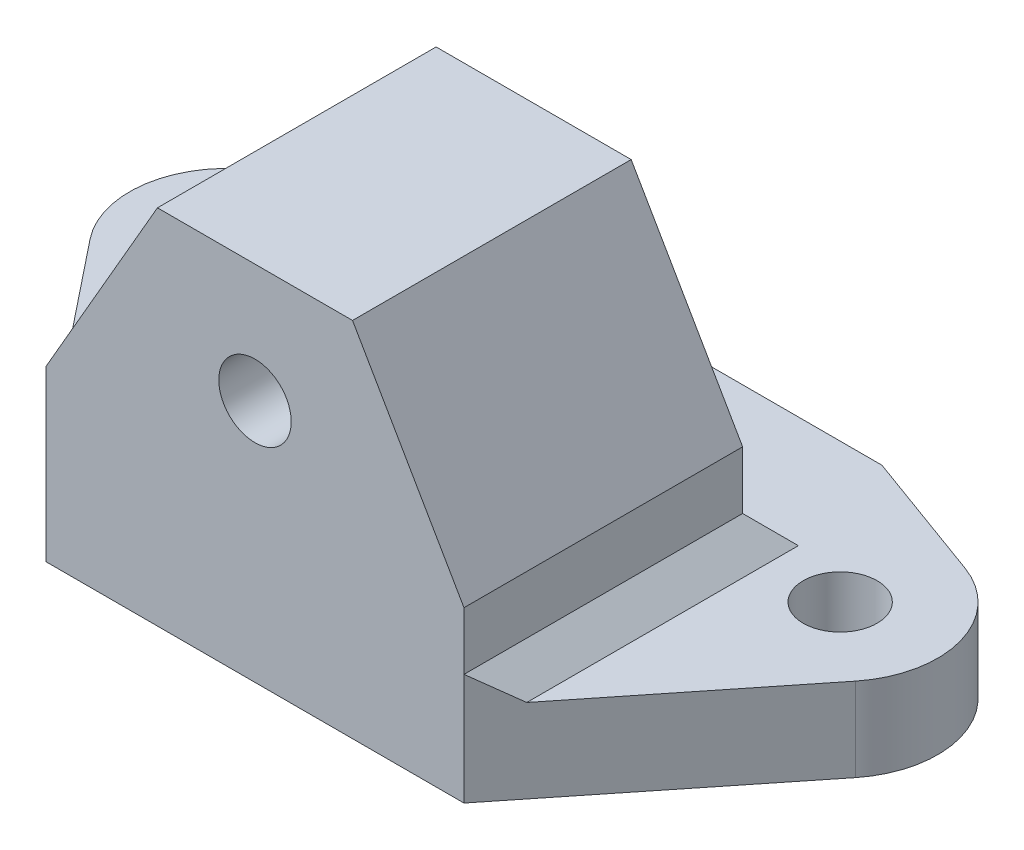
ISO-10303-21;
HEADER;
FILE_DESCRIPTION(('STEP AP214'),'2;1');
FILE_NAME('part.step','',(''),(''),'','','');
FILE_SCHEMA(('AUTOMOTIVE_DESIGN { 1 0 10303 214 1 1 1 1 }'));
ENDSEC;
DATA;
#1=APPLICATION_CONTEXT('core data for automotive mechanical design processes');
#2=APPLICATION_PROTOCOL_DEFINITION('international standard','automotive_design',2000,#1);
#3=PRODUCT_CONTEXT('',#1,'mechanical');
#4=PRODUCT('Part','Part','',(#3));
#5=PRODUCT_RELATED_PRODUCT_CATEGORY('part','',(#4));
#6=PRODUCT_DEFINITION_FORMATION('','',#4);
#7=PRODUCT_DEFINITION_CONTEXT('part definition',#1,'design');
#8=PRODUCT_DEFINITION('design','',#6,#7);
#9=PRODUCT_DEFINITION_SHAPE('','',#8);
#10=(LENGTH_UNIT() NAMED_UNIT(*) SI_UNIT(.MILLI.,.METRE.));
#11=(NAMED_UNIT(*) PLANE_ANGLE_UNIT() SI_UNIT($,.RADIAN.));
#12=(NAMED_UNIT(*) SI_UNIT($,.STERADIAN.) SOLID_ANGLE_UNIT());
#13=UNCERTAINTY_MEASURE_WITH_UNIT(LENGTH_MEASURE(1.E-05),#10,'distance_accuracy_value','');
#14=(GEOMETRIC_REPRESENTATION_CONTEXT(3) GLOBAL_UNCERTAINTY_ASSIGNED_CONTEXT((#13)) GLOBAL_UNIT_ASSIGNED_CONTEXT((#10,
#11,#12)) REPRESENTATION_CONTEXT('',''));
#15=CARTESIAN_POINT('',(0.,0.,0.));
#16=DIRECTION('',(0.,0.,1.));
#17=DIRECTION('',(1.,0.,0.));
#18=AXIS2_PLACEMENT_3D('',#15,#16,#17);
#19=CARTESIAN_POINT('',(15.,13.,30.));
#20=DIRECTION('',(-1.,0.,0.));
#21=DIRECTION('',(0.,-1.,0.));
#22=AXIS2_PLACEMENT_3D('',#19,#20,#21);
#23=PLANE('',#22);
#24=DIRECTION('',(0.,1.,0.));
#25=VECTOR('',#24,1.);
#26=CARTESIAN_POINT('',(15.,13.,30.));
#27=LINE('',#26,#25);
#28=CARTESIAN_POINT('',(15.,-4.99999999999997,30.));
#29=VERTEX_POINT('',#28);
#30=CARTESIAN_POINT('',(15.,-0.85640646055101,30.));
#31=VERTEX_POINT('',#30);
#32=EDGE_CURVE('E123',#29,#31,#27,.T.);
#33=ORIENTED_EDGE('',*,*,#32,.F.);
#34=DIRECTION('',(0.,0.,-1.));
#35=VECTOR('',#34,1.);
#36=CARTESIAN_POINT('',(15.,-4.99999999999998,10.));
#37=LINE('',#36,#35);
#38=CARTESIAN_POINT('',(15.,-4.99999999999998,10.));
#39=VERTEX_POINT('',#38);
#40=EDGE_CURVE('E58',#29,#39,#37,.T.);
#41=ORIENTED_EDGE('',*,*,#40,.T.);
#42=DIRECTION('',(0.,1.,0.));
#43=VECTOR('',#42,1.);
#44=CARTESIAN_POINT('',(15.,13.,10.));
#45=LINE('',#44,#43);
#46=CARTESIAN_POINT('',(15.,-0.856406460551011,10.));
#47=VERTEX_POINT('',#46);
#48=EDGE_CURVE('E229',#39,#47,#45,.T.);
#49=ORIENTED_EDGE('',*,*,#48,.T.);
#50=DIRECTION('',(0.,0.,1.));
#51=VECTOR('',#50,1.);
#52=CARTESIAN_POINT('',(15.,-0.856406460551015,30.));
#53=LINE('',#52,#51);
#54=EDGE_CURVE('E160',#47,#31,#53,.T.);
#55=ORIENTED_EDGE('',*,*,#54,.T.);
#56=EDGE_LOOP('',(#33,#41,#49,#55));
#57=FACE_BOUND('',#56,.T.);
#58=ADVANCED_FACE('F33',(#57),#23,.F.);
#59=CARTESIAN_POINT('',(-15.,13.,30.));
#60=DIRECTION('',(0.,-1.,0.));
#61=DIRECTION('',(0.,0.,-1.));
#62=AXIS2_PLACEMENT_3D('',#59,#60,#61);
#63=PLANE('',#62);
#64=DIRECTION('',(0.,0.,-1.));
#65=VECTOR('',#64,1.);
#66=CARTESIAN_POINT('',(6.99999999999999,13.,30.));
#67=LINE('',#66,#65);
#68=CARTESIAN_POINT('',(6.99999999999998,13.,30.));
#69=VERTEX_POINT('',#68);
#70=CARTESIAN_POINT('',(6.99999999999999,13.,10.));
#71=VERTEX_POINT('',#70);
#72=EDGE_CURVE('E156',#69,#71,#67,.T.);
#73=ORIENTED_EDGE('',*,*,#72,.T.);
#74=DIRECTION('',(1.,0.,0.));
#75=VECTOR('',#74,1.);
#76=CARTESIAN_POINT('',(-20.,13.,10.));
#77=LINE('',#76,#75);
#78=CARTESIAN_POINT('',(-6.99999999999999,13.,10.));
#79=VERTEX_POINT('',#78);
#80=EDGE_CURVE('E116',#79,#71,#77,.T.);
#81=ORIENTED_EDGE('',*,*,#80,.F.);
#82=DIRECTION('',(0.,0.,1.));
#83=VECTOR('',#82,1.);
#84=CARTESIAN_POINT('',(-6.99999999999999,13.,30.));
#85=LINE('',#84,#83);
#86=CARTESIAN_POINT('',(-6.99999999999999,13.,30.));
#87=VERTEX_POINT('',#86);
#88=EDGE_CURVE('E153',#79,#87,#85,.T.);
#89=ORIENTED_EDGE('',*,*,#88,.T.);
#90=DIRECTION('',(-1.,0.,0.));
#91=VECTOR('',#90,1.);
#92=CARTESIAN_POINT('',(-15.,13.,30.));
#93=LINE('',#92,#91);
#94=EDGE_CURVE('E133',#69,#87,#93,.T.);
#95=ORIENTED_EDGE('',*,*,#94,.F.);
#96=EDGE_LOOP('',(#73,#81,#89,#95));
#97=FACE_BOUND('',#96,.T.);
#98=ADVANCED_FACE('F220',(#97),#63,.F.);
#99=CARTESIAN_POINT('',(-15.,13.,30.));
#100=DIRECTION('',(1.,0.,0.));
#101=DIRECTION('',(0.,1.,0.));
#102=AXIS2_PLACEMENT_3D('',#99,#100,#101);
#103=PLANE('',#102);
#104=DIRECTION('',(0.,-1.,0.));
#105=VECTOR('',#104,1.);
#106=CARTESIAN_POINT('',(-15.,13.,10.));
#107=LINE('',#106,#105);
#108=CARTESIAN_POINT('',(-15.,-0.856406460551015,10.));
#109=VERTEX_POINT('',#108);
#110=CARTESIAN_POINT('',(-15.,-4.99999999999998,10.));
#111=VERTEX_POINT('',#110);
#112=EDGE_CURVE('E216',#109,#111,#107,.T.);
#113=ORIENTED_EDGE('',*,*,#112,.T.);
#114=DIRECTION('',(0.,0.,1.));
#115=VECTOR('',#114,1.);
#116=CARTESIAN_POINT('',(-15.,-4.99999999999998,30.));
#117=LINE('',#116,#115);
#118=CARTESIAN_POINT('',(-15.,-4.99999999999998,30.));
#119=VERTEX_POINT('',#118);
#120=EDGE_CURVE('E110',#111,#119,#117,.T.);
#121=ORIENTED_EDGE('',*,*,#120,.T.);
#122=DIRECTION('',(0.,-1.,0.));
#123=VECTOR('',#122,1.);
#124=CARTESIAN_POINT('',(-15.,13.,30.));
#125=LINE('',#124,#123);
#126=CARTESIAN_POINT('',(-15.,-0.856406460551013,30.));
#127=VERTEX_POINT('',#126);
#128=EDGE_CURVE('E164',#127,#119,#125,.T.);
#129=ORIENTED_EDGE('',*,*,#128,.F.);
#130=DIRECTION('',(0.,0.,-1.));
#131=VECTOR('',#130,1.);
#132=CARTESIAN_POINT('',(-15.,-0.856406460551015,30.));
#133=LINE('',#132,#131);
#134=EDGE_CURVE('E188',#127,#109,#133,.T.);
#135=ORIENTED_EDGE('',*,*,#134,.T.);
#136=EDGE_LOOP('',(#113,#121,#129,#135));
#137=FACE_BOUND('',#136,.T.);
#138=ADVANCED_FACE('F206',(#137),#103,.F.);
#139=CARTESIAN_POINT('',(-15.,-13.,30.));
#140=DIRECTION('',(0.,1.,0.));
#141=DIRECTION('',(0.,0.,1.));
#142=AXIS2_PLACEMENT_3D('',#139,#140,#141);
#143=PLANE('',#142);
#144=DIRECTION('',(1.,0.,0.));
#145=VECTOR('',#144,1.);
#146=CARTESIAN_POINT('',(-15.,-13.,0.));
#147=LINE('',#146,#145);
#148=CARTESIAN_POINT('',(-15.,-13.,0.));
#149=VERTEX_POINT('',#148);
#150=CARTESIAN_POINT('',(15.,-13.,0.));
#151=VERTEX_POINT('',#150);
#152=EDGE_CURVE('E126',#149,#151,#147,.T.);
#153=ORIENTED_EDGE('',*,*,#152,.T.);
#154=DIRECTION('',(0.939597315436242,0.,0.342281879194631));
#155=VECTOR('',#154,1.);
#156=CARTESIAN_POINT('',(15.,-13.,0.));
#157=LINE('',#156,#155);
#158=CARTESIAN_POINT('',(24.3959731543624,-13.,3.42281879194631));
#159=VERTEX_POINT('',#158);
#160=EDGE_CURVE('E243',#151,#159,#157,.T.);
#161=ORIENTED_EDGE('',*,*,#160,.T.);
#162=CARTESIAN_POINT('',(22.,-13.,10.));
#163=DIRECTION('',(0.,-1.,0.));
#164=DIRECTION('',(0.,0.,1.));
#165=AXIS2_PLACEMENT_3D('',#162,#163,#164);
#166=CIRCLE('',#165,7.);
#167=CARTESIAN_POINT('',(27.4721603563474,-13.,14.3652561247216));
#168=VERTEX_POINT('',#167);
#169=EDGE_CURVE('E238',#159,#168,#166,.T.);
#170=ORIENTED_EDGE('',*,*,#169,.T.);
#171=DIRECTION('',(-0.623608017817372,0.,0.78173719376392));
#172=VECTOR('',#171,1.);
#173=CARTESIAN_POINT('',(15.,-13.,30.));
#174=LINE('',#173,#172);
#175=CARTESIAN_POINT('',(15.,-13.,30.));
#176=VERTEX_POINT('',#175);
#177=EDGE_CURVE('E246',#168,#176,#174,.T.);
#178=ORIENTED_EDGE('',*,*,#177,.T.);
#179=DIRECTION('',(1.,0.,0.));
#180=VECTOR('',#179,1.);
#181=CARTESIAN_POINT('',(-15.,-13.,30.));
#182=LINE('',#181,#180);
#183=CARTESIAN_POINT('',(-15.,-13.,30.));
#184=VERTEX_POINT('',#183);
#185=EDGE_CURVE('E157',#184,#176,#182,.T.);
#186=ORIENTED_EDGE('',*,*,#185,.F.);
#187=DIRECTION('',(-0.623608017817372,0.,-0.78173719376392));
#188=VECTOR('',#187,1.);
#189=CARTESIAN_POINT('',(-15.,-13.,30.));
#190=LINE('',#189,#188);
#191=CARTESIAN_POINT('',(-27.4721603563474,-13.,14.3652561247216));
#192=VERTEX_POINT('',#191);
#193=EDGE_CURVE('E260',#184,#192,#190,.T.);
#194=ORIENTED_EDGE('',*,*,#193,.T.);
#195=CARTESIAN_POINT('',(-22.,-13.,10.));
#196=DIRECTION('',(0.,-1.,0.));
#197=DIRECTION('',(0.,0.,-1.));
#198=AXIS2_PLACEMENT_3D('',#195,#196,#197);
#199=CIRCLE('',#198,7.);
#200=CARTESIAN_POINT('',(-24.3959731543624,-13.,3.42281879194631));
#201=VERTEX_POINT('',#200);
#202=EDGE_CURVE('E268',#192,#201,#199,.T.);
#203=ORIENTED_EDGE('',*,*,#202,.T.);
#204=DIRECTION('',(0.939597315436242,0.,-0.34228187919463));
#205=VECTOR('',#204,1.);
#206=CARTESIAN_POINT('',(-15.,-13.,0.));
#207=LINE('',#206,#205);
#208=EDGE_CURVE('E182',#201,#149,#207,.T.);
#209=ORIENTED_EDGE('',*,*,#208,.T.);
#210=EDGE_LOOP('',(#153,#161,#170,#178,#186,#194,#203,#209));
#211=FACE_BOUND('',#210,.T.);
#212=CARTESIAN_POINT('',(-22.,-13.,10.));
#213=DIRECTION('',(0.,-1.,0.));
#214=DIRECTION('',(0.,0.,-1.));
#215=AXIS2_PLACEMENT_3D('',#212,#213,#214);
#216=CIRCLE('',#215,2.65);
#217=CARTESIAN_POINT('',(-22.,-13.,7.35));
#218=VERTEX_POINT('',#217);
#219=EDGE_CURVE('E254',#218,#218,#216,.T.);
#220=ORIENTED_EDGE('',*,*,#219,.F.);
#221=EDGE_LOOP('',(#220));
#222=FACE_BOUND('',#221,.T.);
#223=CARTESIAN_POINT('',(22.,-13.,10.));
#224=DIRECTION('',(0.,-1.,0.));
#225=DIRECTION('',(0.,0.,1.));
#226=AXIS2_PLACEMENT_3D('',#223,#224,#225);
#227=CIRCLE('',#226,2.65);
#228=CARTESIAN_POINT('',(22.,-13.,12.65));
#229=VERTEX_POINT('',#228);
#230=EDGE_CURVE('E234',#229,#229,#227,.T.);
#231=ORIENTED_EDGE('',*,*,#230,.F.);
#232=EDGE_LOOP('',(#231));
#233=FACE_BOUND('',#232,.T.);
#234=ADVANCED_FACE('F347',(#211,#222,#233),#143,.F.);
#235=CARTESIAN_POINT('',(0.,0.,30.));
#236=DIRECTION('',(0.,0.,1.));
#237=DIRECTION('',(1.,0.,0.));
#238=AXIS2_PLACEMENT_3D('',#235,#236,#237);
#239=PLANE('',#238);
#240=CARTESIAN_POINT('',(0.,4.5,30.));
#241=DIRECTION('',(0.,0.,1.));
#242=DIRECTION('',(1.,0.,0.));
#243=AXIS2_PLACEMENT_3D('',#240,#241,#242);
#244=CIRCLE('',#243,2.6);
#245=CARTESIAN_POINT('',(2.6,4.5,30.));
#246=VERTEX_POINT('',#245);
#247=EDGE_CURVE('E282',#246,#246,#244,.T.);
#248=ORIENTED_EDGE('',*,*,#247,.F.);
#249=EDGE_LOOP('',(#248));
#250=FACE_BOUND('',#249,.T.);
#251=EDGE_CURVE('E50',#176,#29,#27,.T.);
#252=ORIENTED_EDGE('',*,*,#251,.T.);
#253=ORIENTED_EDGE('',*,*,#32,.T.);
#254=DIRECTION('',(0.500000000000001,-0.866025403784438,0.));
#255=VECTOR('',#254,1.);
#256=CARTESIAN_POINT('',(10.8791651245988,6.28108891324554,30.));
#257=LINE('',#256,#255);
#258=EDGE_CURVE('E190',#31,#69,#257,.F.);
#259=ORIENTED_EDGE('',*,*,#258,.T.);
#260=ORIENTED_EDGE('',*,*,#94,.T.);
#261=DIRECTION('',(0.500000000000001,0.866025403784438,0.));
#262=VECTOR('',#261,1.);
#263=CARTESIAN_POINT('',(-10.8791651245988,6.28108891324554,30.));
#264=LINE('',#263,#262);
#265=EDGE_CURVE('E163',#87,#127,#264,.F.);
#266=ORIENTED_EDGE('',*,*,#265,.T.);
#267=ORIENTED_EDGE('',*,*,#128,.T.);
#268=DIRECTION('',(0.,-1.,0.));
#269=VECTOR('',#268,1.);
#270=CARTESIAN_POINT('',(-15.,-7.,30.));
#271=LINE('',#270,#269);
#272=EDGE_CURVE('E72',#119,#184,#271,.T.);
#273=ORIENTED_EDGE('',*,*,#272,.T.);
#274=ORIENTED_EDGE('',*,*,#185,.T.);
#275=EDGE_LOOP('',(#252,#253,#259,#260,#266,#267,#273,#274));
#276=FACE_BOUND('',#275,.T.);
#277=ADVANCED_FACE('F199',(#250,#276),#239,.T.);
#278=CARTESIAN_POINT('',(0.,0.,0.));
#279=DIRECTION('',(0.,0.,1.));
#280=DIRECTION('',(1.,0.,0.));
#281=AXIS2_PLACEMENT_3D('',#278,#279,#280);
#282=PLANE('',#281);
#283=DIRECTION('',(0.,-1.,0.));
#284=VECTOR('',#283,1.);
#285=CARTESIAN_POINT('',(-15.,-7.,0.));
#286=LINE('',#285,#284);
#287=CARTESIAN_POINT('',(-15.,-6.99999999999998,0.));
#288=VERTEX_POINT('',#287);
#289=EDGE_CURVE('E276',#288,#149,#286,.T.);
#290=ORIENTED_EDGE('',*,*,#289,.F.);
#291=DIRECTION('',(1.,0.,0.));
#292=VECTOR('',#291,1.);
#293=CARTESIAN_POINT('',(-20.,-6.99999999999998,0.));
#294=LINE('',#293,#292);
#295=CARTESIAN_POINT('',(15.,-6.99999999999998,0.));
#296=VERTEX_POINT('',#295);
#297=EDGE_CURVE('E113',#288,#296,#294,.T.);
#298=ORIENTED_EDGE('',*,*,#297,.T.);
#299=DIRECTION('',(0.,1.,0.));
#300=VECTOR('',#299,1.);
#301=CARTESIAN_POINT('',(15.,13.,0.));
#302=LINE('',#301,#300);
#303=EDGE_CURVE('E139',#151,#296,#302,.T.);
#304=ORIENTED_EDGE('',*,*,#303,.F.);
#305=ORIENTED_EDGE('',*,*,#152,.F.);
#306=EDGE_LOOP('',(#290,#298,#304,#305));
#307=FACE_BOUND('',#306,.T.);
#308=ADVANCED_FACE('F303',(#307),#282,.F.);
#309=CARTESIAN_POINT('',(0.,4.5,15.));
#310=DIRECTION('',(0.,0.,-1.));
#311=DIRECTION('',(-1.,0.,0.));
#312=AXIS2_PLACEMENT_3D('',#309,#310,#311);
#313=CYLINDRICAL_SURFACE('',#312,5.25);
#314=CARTESIAN_POINT('',(0.,4.5,10.));
#315=DIRECTION('',(0.,0.,1.));
#316=DIRECTION('',(1.,0.,0.));
#317=AXIS2_PLACEMENT_3D('',#314,#315,#316);
#318=CIRCLE('',#317,5.25);
#319=CARTESIAN_POINT('',(5.25,4.5,10.));
#320=VERTEX_POINT('',#319);
#321=EDGE_CURVE('E231',#320,#320,#318,.T.);
#322=ORIENTED_EDGE('',*,*,#321,.F.);
#323=EDGE_LOOP('',(#322));
#324=FACE_BOUND('',#323,.T.);
#325=CARTESIAN_POINT('',(0.,4.5,15.));
#326=DIRECTION('',(0.,0.,1.));
#327=DIRECTION('',(1.,0.,0.));
#328=AXIS2_PLACEMENT_3D('',#325,#326,#327);
#329=CIRCLE('',#328,5.25);
#330=CARTESIAN_POINT('',(5.25,4.5,15.));
#331=VERTEX_POINT('',#330);
#332=EDGE_CURVE('E131',#331,#331,#329,.T.);
#333=ORIENTED_EDGE('',*,*,#332,.T.);
#334=EDGE_LOOP('',(#333));
#335=FACE_BOUND('',#334,.T.);
#336=ADVANCED_FACE('F423',(#324,#335),#313,.F.);
#337=CARTESIAN_POINT('',(0.,4.5,15.));
#338=DIRECTION('',(0.,0.,1.));
#339=DIRECTION('',(1.,0.,0.));
#340=AXIS2_PLACEMENT_3D('',#337,#338,#339);
#341=PLANE('',#340);
#342=CARTESIAN_POINT('',(0.,4.5,15.));
#343=DIRECTION('',(0.,0.,1.));
#344=DIRECTION('',(1.,0.,0.));
#345=AXIS2_PLACEMENT_3D('',#342,#343,#344);
#346=CIRCLE('',#345,2.6);
#347=CARTESIAN_POINT('',(2.6,4.5,15.));
#348=VERTEX_POINT('',#347);
#349=EDGE_CURVE('E280',#348,#348,#346,.T.);
#350=ORIENTED_EDGE('',*,*,#349,.T.);
#351=EDGE_LOOP('',(#350));
#352=FACE_BOUND('',#351,.T.);
#353=ORIENTED_EDGE('',*,*,#332,.F.);
#354=EDGE_LOOP('',(#353));
#355=FACE_BOUND('',#354,.T.);
#356=ADVANCED_FACE('F420',(#352,#355),#341,.F.);
#357=CARTESIAN_POINT('',(0.,4.5,30.001));
#358=DIRECTION('',(0.,0.,-1.));
#359=DIRECTION('',(-1.,0.,0.));
#360=AXIS2_PLACEMENT_3D('',#357,#358,#359);
#361=CYLINDRICAL_SURFACE('',#360,2.6);
#362=ORIENTED_EDGE('',*,*,#247,.T.);
#363=EDGE_LOOP('',(#362));
#364=FACE_BOUND('',#363,.T.);
#365=ORIENTED_EDGE('',*,*,#349,.F.);
#366=EDGE_LOOP('',(#365));
#367=FACE_BOUND('',#366,.T.);
#368=ADVANCED_FACE('F413',(#364,#367),#361,.F.);
#369=CARTESIAN_POINT('',(-15.,-7.,0.));
#370=DIRECTION('',(-0.34228187919463,0.,-0.939597315436242));
#371=DIRECTION('',(-0.939597315436242,0.,0.342281879194631));
#372=AXIS2_PLACEMENT_3D('',#369,#370,#371);
#373=PLANE('',#372);
#374=ORIENTED_EDGE('',*,*,#208,.F.);
#375=DIRECTION('',(0.,-1.,0.));
#376=VECTOR('',#375,1.);
#377=CARTESIAN_POINT('',(-24.3959731543624,-7.,3.42281879194631));
#378=LINE('',#377,#376);
#379=CARTESIAN_POINT('',(-24.3959731543624,-7.,3.42281879194631));
#380=VERTEX_POINT('',#379);
#381=EDGE_CURVE('E273',#380,#201,#378,.T.);
#382=ORIENTED_EDGE('',*,*,#381,.F.);
#383=DIRECTION('',(0.939597315436242,0.,-0.34228187919463));
#384=VECTOR('',#383,1.);
#385=CARTESIAN_POINT('',(-15.,-7.,0.));
#386=LINE('',#385,#384);
#387=EDGE_CURVE('E265',#380,#288,#386,.T.);
#388=ORIENTED_EDGE('',*,*,#387,.T.);
#389=ORIENTED_EDGE('',*,*,#289,.T.);
#390=EDGE_LOOP('',(#374,#382,#388,#389));
#391=FACE_BOUND('',#390,.T.);
#392=ADVANCED_FACE('F352',(#391),#373,.T.);
#393=CARTESIAN_POINT('',(-22.,-7.,10.));
#394=DIRECTION('',(0.,-1.,0.));
#395=DIRECTION('',(0.,0.,-1.));
#396=AXIS2_PLACEMENT_3D('',#393,#394,#395);
#397=CYLINDRICAL_SURFACE('',#396,7.);
#398=ORIENTED_EDGE('',*,*,#202,.F.);
#399=DIRECTION('',(0.,-1.,0.));
#400=VECTOR('',#399,1.);
#401=CARTESIAN_POINT('',(-27.4721603563474,-7.,14.3652561247216));
#402=LINE('',#401,#400);
#403=CARTESIAN_POINT('',(-27.4721603563474,-7.,14.3652561247216));
#404=VERTEX_POINT('',#403);
#405=EDGE_CURVE('E277',#404,#192,#402,.T.);
#406=ORIENTED_EDGE('',*,*,#405,.F.);
#407=CARTESIAN_POINT('',(-22.,-7.,10.));
#408=DIRECTION('',(0.,-1.,0.));
#409=DIRECTION('',(0.,0.,-1.));
#410=AXIS2_PLACEMENT_3D('',#407,#408,#409);
#411=CIRCLE('',#410,7.);
#412=EDGE_CURVE('E181',#404,#380,#411,.T.);
#413=ORIENTED_EDGE('',*,*,#412,.T.);
#414=ORIENTED_EDGE('',*,*,#381,.T.);
#415=EDGE_LOOP('',(#398,#406,#413,#414));
#416=FACE_BOUND('',#415,.T.);
#417=ADVANCED_FACE('F366',(#416),#397,.T.);
#418=CARTESIAN_POINT('',(-15.,-7.,30.));
#419=DIRECTION('',(-0.78173719376392,0.,0.623608017817372));
#420=DIRECTION('',(0.623608017817372,0.,0.78173719376392));
#421=AXIS2_PLACEMENT_3D('',#418,#419,#420);
#422=PLANE('',#421);
#423=ORIENTED_EDGE('',*,*,#193,.F.);
#424=ORIENTED_EDGE('',*,*,#272,.F.);
#425=DIRECTION('',(0.529149317304264,0.529149317304272,0.663326465620703));
#426=VECTOR('',#425,1.);
#427=CARTESIAN_POINT('',(-15.,-4.99999999999998,30.));
#428=LINE('',#427,#426);
#429=CARTESIAN_POINT('',(-17.,-7.,27.4928571428571));
#430=VERTEX_POINT('',#429);
#431=EDGE_CURVE('E42',#119,#430,#428,.F.);
#432=ORIENTED_EDGE('',*,*,#431,.T.);
#433=DIRECTION('',(-0.623608017817372,0.,-0.78173719376392));
#434=VECTOR('',#433,1.);
#435=CARTESIAN_POINT('',(-15.,-7.,30.));
#436=LINE('',#435,#434);
#437=EDGE_CURVE('E178',#430,#404,#436,.T.);
#438=ORIENTED_EDGE('',*,*,#437,.T.);
#439=ORIENTED_EDGE('',*,*,#405,.T.);
#440=EDGE_LOOP('',(#423,#424,#432,#438,#439));
#441=FACE_BOUND('',#440,.T.);
#442=ADVANCED_FACE('F362',(#441),#422,.T.);
#443=CARTESIAN_POINT('',(-22.,-7.,10.));
#444=DIRECTION('',(0.,-1.,0.));
#445=DIRECTION('',(0.,0.,-1.));
#446=AXIS2_PLACEMENT_3D('',#443,#444,#445);
#447=PLANE('',#446);
#448=CARTESIAN_POINT('',(-22.,-7.,10.));
#449=DIRECTION('',(0.,-1.,0.));
#450=DIRECTION('',(0.,0.,-1.));
#451=AXIS2_PLACEMENT_3D('',#448,#449,#450);
#452=CIRCLE('',#451,2.65);
#453=CARTESIAN_POINT('',(-22.,-7.,7.35));
#454=VERTEX_POINT('',#453);
#455=EDGE_CURVE('E257',#454,#454,#452,.T.);
#456=ORIENTED_EDGE('',*,*,#455,.T.);
#457=EDGE_LOOP('',(#456));
#458=FACE_BOUND('',#457,.T.);
#459=ORIENTED_EDGE('',*,*,#437,.F.);
#460=DIRECTION('',(0.,0.,-1.));
#461=VECTOR('',#460,1.);
#462=CARTESIAN_POINT('',(-17.,-7.,10.));
#463=LINE('',#462,#461);
#464=CARTESIAN_POINT('',(-17.,-7.,8.00000000000001));
#465=VERTEX_POINT('',#464);
#466=EDGE_CURVE('E101',#430,#465,#463,.T.);
#467=ORIENTED_EDGE('',*,*,#466,.T.);
#468=DIRECTION('',(1.,0.,0.));
#469=VECTOR('',#468,1.);
#470=CARTESIAN_POINT('',(15.,-7.,8.00000000000001));
#471=LINE('',#470,#469);
#472=CARTESIAN_POINT('',(17.,-7.,8.00000000000001));
#473=VERTEX_POINT('',#472);
#474=EDGE_CURVE('E92',#465,#473,#471,.T.);
#475=ORIENTED_EDGE('',*,*,#474,.T.);
#476=DIRECTION('',(0.,0.,1.));
#477=VECTOR('',#476,1.);
#478=CARTESIAN_POINT('',(17.,-7.,30.));
#479=LINE('',#478,#477);
#480=CARTESIAN_POINT('',(17.,-7.,27.4928571428571));
#481=VERTEX_POINT('',#480);
#482=EDGE_CURVE('E98',#473,#481,#479,.T.);
#483=ORIENTED_EDGE('',*,*,#482,.T.);
#484=DIRECTION('',(-0.623608017817372,0.,0.78173719376392));
#485=VECTOR('',#484,1.);
#486=CARTESIAN_POINT('',(15.,-7.,30.));
#487=LINE('',#486,#485);
#488=CARTESIAN_POINT('',(27.4721603563474,-7.,14.3652561247216));
#489=VERTEX_POINT('',#488);
#490=EDGE_CURVE('E146',#489,#481,#487,.T.);
#491=ORIENTED_EDGE('',*,*,#490,.F.);
#492=CARTESIAN_POINT('',(22.,-7.,10.));
#493=DIRECTION('',(0.,-1.,0.));
#494=DIRECTION('',(0.,0.,1.));
#495=AXIS2_PLACEMENT_3D('',#492,#493,#494);
#496=CIRCLE('',#495,7.);
#497=CARTESIAN_POINT('',(24.3959731543624,-7.,3.42281879194631));
#498=VERTEX_POINT('',#497);
#499=EDGE_CURVE('E150',#498,#489,#496,.T.);
#500=ORIENTED_EDGE('',*,*,#499,.F.);
#501=DIRECTION('',(0.939597315436242,0.,0.342281879194631));
#502=VECTOR('',#501,1.);
#503=CARTESIAN_POINT('',(15.,-7.,0.));
#504=LINE('',#503,#502);
#505=EDGE_CURVE('E142',#296,#498,#504,.T.);
#506=ORIENTED_EDGE('',*,*,#505,.F.);
#507=ORIENTED_EDGE('',*,*,#297,.F.);
#508=ORIENTED_EDGE('',*,*,#387,.F.);
#509=ORIENTED_EDGE('',*,*,#412,.F.);
#510=EDGE_LOOP('',(#459,#467,#475,#483,#491,#500,#506,#507,#508,#509));
#511=FACE_BOUND('',#510,.T.);
#512=CARTESIAN_POINT('',(22.,-7.,10.));
#513=DIRECTION('',(0.,-1.,0.));
#514=DIRECTION('',(0.,0.,1.));
#515=AXIS2_PLACEMENT_3D('',#512,#513,#514);
#516=CIRCLE('',#515,2.65);
#517=CARTESIAN_POINT('',(22.,-7.,12.65));
#518=VERTEX_POINT('',#517);
#519=EDGE_CURVE('E235',#518,#518,#516,.T.);
#520=ORIENTED_EDGE('',*,*,#519,.T.);
#521=EDGE_LOOP('',(#520));
#522=FACE_BOUND('',#521,.T.);
#523=ADVANCED_FACE('F95',(#458,#511,#522),#447,.F.);
#524=CARTESIAN_POINT('',(-22.,-7.,10.));
#525=DIRECTION('',(0.,-1.,0.));
#526=DIRECTION('',(0.,0.,-1.));
#527=AXIS2_PLACEMENT_3D('',#524,#525,#526);
#528=CYLINDRICAL_SURFACE('',#527,2.65);
#529=ORIENTED_EDGE('',*,*,#455,.F.);
#530=EDGE_LOOP('',(#529));
#531=FACE_BOUND('',#530,.T.);
#532=ORIENTED_EDGE('',*,*,#219,.T.);
#533=EDGE_LOOP('',(#532));
#534=FACE_BOUND('',#533,.T.);
#535=ADVANCED_FACE('F404',(#531,#534),#528,.F.);
#536=CARTESIAN_POINT('',(22.,-7.,10.));
#537=DIRECTION('',(0.,-1.,0.));
#538=DIRECTION('',(0.,0.,-1.));
#539=AXIS2_PLACEMENT_3D('',#536,#537,#538);
#540=CYLINDRICAL_SURFACE('',#539,7.);
#541=ORIENTED_EDGE('',*,*,#169,.F.);
#542=DIRECTION('',(0.,-1.,0.));
#543=VECTOR('',#542,1.);
#544=CARTESIAN_POINT('',(24.3959731543624,-7.,3.42281879194631));
#545=LINE('',#544,#543);
#546=EDGE_CURVE('E251',#498,#159,#545,.T.);
#547=ORIENTED_EDGE('',*,*,#546,.F.);
#548=ORIENTED_EDGE('',*,*,#499,.T.);
#549=DIRECTION('',(0.,-1.,0.));
#550=VECTOR('',#549,1.);
#551=CARTESIAN_POINT('',(27.4721603563474,-7.,14.3652561247216));
#552=LINE('',#551,#550);
#553=EDGE_CURVE('E145',#489,#168,#552,.T.);
#554=ORIENTED_EDGE('',*,*,#553,.T.);
#555=EDGE_LOOP('',(#541,#547,#548,#554));
#556=FACE_BOUND('',#555,.T.);
#557=ADVANCED_FACE('F345',(#556),#540,.T.);
#558=CARTESIAN_POINT('',(15.,-7.,0.));
#559=DIRECTION('',(0.342281879194631,0.,-0.939597315436242));
#560=DIRECTION('',(-0.939597315436242,0.,-0.342281879194631));
#561=AXIS2_PLACEMENT_3D('',#558,#559,#560);
#562=PLANE('',#561);
#563=ORIENTED_EDGE('',*,*,#160,.F.);
#564=ORIENTED_EDGE('',*,*,#303,.T.);
#565=ORIENTED_EDGE('',*,*,#505,.T.);
#566=ORIENTED_EDGE('',*,*,#546,.T.);
#567=EDGE_LOOP('',(#563,#564,#565,#566));
#568=FACE_BOUND('',#567,.T.);
#569=ADVANCED_FACE('F293',(#568),#562,.T.);
#570=CARTESIAN_POINT('',(15.,-7.,30.));
#571=DIRECTION('',(0.78173719376392,0.,0.623608017817372));
#572=DIRECTION('',(0.623608017817372,0.,-0.78173719376392));
#573=AXIS2_PLACEMENT_3D('',#570,#571,#572);
#574=PLANE('',#573);
#575=ORIENTED_EDGE('',*,*,#177,.F.);
#576=ORIENTED_EDGE('',*,*,#553,.F.);
#577=ORIENTED_EDGE('',*,*,#490,.T.);
#578=DIRECTION('',(0.529149317304265,-0.529149317304271,-0.663326465620704));
#579=VECTOR('',#578,1.);
#580=CARTESIAN_POINT('',(15.,-4.99999999999998,30.));
#581=LINE('',#580,#579);
#582=EDGE_CURVE('E11',#481,#29,#581,.F.);
#583=ORIENTED_EDGE('',*,*,#582,.T.);
#584=ORIENTED_EDGE('',*,*,#251,.F.);
#585=EDGE_LOOP('',(#575,#576,#577,#583,#584));
#586=FACE_BOUND('',#585,.T.);
#587=ADVANCED_FACE('F341',(#586),#574,.T.);
#588=CARTESIAN_POINT('',(22.,-7.,10.));
#589=DIRECTION('',(0.,-1.,0.));
#590=DIRECTION('',(0.,0.,-1.));
#591=AXIS2_PLACEMENT_3D('',#588,#589,#590);
#592=CYLINDRICAL_SURFACE('',#591,2.65);
#593=ORIENTED_EDGE('',*,*,#519,.F.);
#594=EDGE_LOOP('',(#593));
#595=FACE_BOUND('',#594,.T.);
#596=ORIENTED_EDGE('',*,*,#230,.T.);
#597=EDGE_LOOP('',(#596));
#598=FACE_BOUND('',#597,.T.);
#599=ADVANCED_FACE('F384',(#595,#598),#592,.F.);
#600=CARTESIAN_POINT('',(6.99999999999999,13.,30.));
#601=DIRECTION('',(-0.866025403784438,-0.500000000000001,0.));
#602=DIRECTION('',(0.,0.,-1.));
#603=AXIS2_PLACEMENT_3D('',#600,#601,#602);
#604=PLANE('',#603);
#605=DIRECTION('',(-0.500000000000001,0.866025403784438,0.));
#606=VECTOR('',#605,1.);
#607=CARTESIAN_POINT('',(6.99999999999999,13.,10.));
#608=LINE('',#607,#606);
#609=EDGE_CURVE('E223',#71,#47,#608,.F.);
#610=ORIENTED_EDGE('',*,*,#609,.F.);
#611=ORIENTED_EDGE('',*,*,#72,.F.);
#612=ORIENTED_EDGE('',*,*,#258,.F.);
#613=ORIENTED_EDGE('',*,*,#54,.F.);
#614=EDGE_LOOP('',(#610,#611,#612,#613));
#615=FACE_BOUND('',#614,.T.);
#616=ADVANCED_FACE('F333',(#615),#604,.F.);
#617=CARTESIAN_POINT('',(-15.,-0.856406460551015,30.));
#618=DIRECTION('',(0.866025403784438,-0.500000000000001,0.));
#619=DIRECTION('',(0.,0.,-1.));
#620=AXIS2_PLACEMENT_3D('',#617,#618,#619);
#621=PLANE('',#620);
#622=DIRECTION('',(-0.500000000000001,-0.866025403784438,0.));
#623=VECTOR('',#622,1.);
#624=CARTESIAN_POINT('',(-15.,-0.856406460551015,10.));
#625=LINE('',#624,#623);
#626=EDGE_CURVE('E185',#109,#79,#625,.F.);
#627=ORIENTED_EDGE('',*,*,#626,.F.);
#628=ORIENTED_EDGE('',*,*,#134,.F.);
#629=ORIENTED_EDGE('',*,*,#265,.F.);
#630=ORIENTED_EDGE('',*,*,#88,.F.);
#631=EDGE_LOOP('',(#627,#628,#629,#630));
#632=FACE_BOUND('',#631,.T.);
#633=ADVANCED_FACE('F208',(#632),#621,.F.);
#634=CARTESIAN_POINT('',(-20.,13.,10.));
#635=DIRECTION('',(0.,0.,1.));
#636=DIRECTION('',(1.,0.,0.));
#637=AXIS2_PLACEMENT_3D('',#634,#635,#636);
#638=PLANE('',#637);
#639=ORIENTED_EDGE('',*,*,#321,.T.);
#640=EDGE_LOOP('',(#639));
#641=FACE_BOUND('',#640,.T.);
#642=ORIENTED_EDGE('',*,*,#48,.F.);
#643=DIRECTION('',(-1.,0.,0.));
#644=VECTOR('',#643,1.);
#645=CARTESIAN_POINT('',(-15.,-4.99999999999998,10.));
#646=LINE('',#645,#644);
#647=EDGE_CURVE('E83',#39,#111,#646,.T.);
#648=ORIENTED_EDGE('',*,*,#647,.T.);
#649=ORIENTED_EDGE('',*,*,#112,.F.);
#650=ORIENTED_EDGE('',*,*,#626,.T.);
#651=ORIENTED_EDGE('',*,*,#80,.T.);
#652=ORIENTED_EDGE('',*,*,#609,.T.);
#653=EDGE_LOOP('',(#642,#648,#649,#650,#651,#652));
#654=FACE_BOUND('',#653,.T.);
#655=ADVANCED_FACE('F212',(#641,#654),#638,.F.);
#656=CARTESIAN_POINT('',(15.,-4.99999999999998,30.));
#657=DIRECTION('',(0.707106781186551,0.707106781186544,0.));
#658=DIRECTION('',(0.,0.,1.));
#659=AXIS2_PLACEMENT_3D('',#656,#657,#658);
#660=PLANE('',#659);
#661=ORIENTED_EDGE('',*,*,#582,.F.);
#662=ORIENTED_EDGE('',*,*,#482,.F.);
#663=DIRECTION('',(-0.577350269189624,0.57735026918963,0.577350269189624));
#664=VECTOR('',#663,1.);
#665=CARTESIAN_POINT('',(8.33333333333338,1.66666666666671,16.6666666666666));
#666=LINE('',#665,#664);
#667=EDGE_CURVE('E37',#39,#473,#666,.F.);
#668=ORIENTED_EDGE('',*,*,#667,.F.);
#669=ORIENTED_EDGE('',*,*,#40,.F.);
#670=EDGE_LOOP('',(#661,#662,#668,#669));
#671=FACE_BOUND('',#670,.T.);
#672=ADVANCED_FACE('F35',(#671),#660,.T.);
#673=CARTESIAN_POINT('',(-22.,-7.,8.00000000000001));
#674=DIRECTION('',(0.,0.707106781186544,-0.707106781186551));
#675=DIRECTION('',(-1.,0.,0.));
#676=AXIS2_PLACEMENT_3D('',#673,#674,#675);
#677=PLANE('',#676);
#678=ORIENTED_EDGE('',*,*,#667,.T.);
#679=ORIENTED_EDGE('',*,*,#474,.F.);
#680=DIRECTION('',(0.577350269189622,0.57735026918963,0.577350269189625));
#681=VECTOR('',#680,1.);
#682=CARTESIAN_POINT('',(-18.6666666666666,-8.66666666666667,6.33333333333336));
#683=LINE('',#682,#681);
#684=EDGE_CURVE('E114',#111,#465,#683,.F.);
#685=ORIENTED_EDGE('',*,*,#684,.F.);
#686=ORIENTED_EDGE('',*,*,#647,.F.);
#687=EDGE_LOOP('',(#678,#679,#685,#686));
#688=FACE_BOUND('',#687,.T.);
#689=ADVANCED_FACE('F112',(#688),#677,.T.);
#690=CARTESIAN_POINT('',(-15.,-4.99999999999998,30.));
#691=DIRECTION('',(-0.707106781186552,0.707106781186542,0.));
#692=DIRECTION('',(0.,0.,-1.));
#693=AXIS2_PLACEMENT_3D('',#690,#691,#692);
#694=PLANE('',#693);
#695=ORIENTED_EDGE('',*,*,#684,.T.);
#696=ORIENTED_EDGE('',*,*,#466,.F.);
#697=ORIENTED_EDGE('',*,*,#431,.F.);
#698=ORIENTED_EDGE('',*,*,#120,.F.);
#699=EDGE_LOOP('',(#695,#696,#697,#698));
#700=FACE_BOUND('',#699,.T.);
#701=ADVANCED_FACE('F368',(#700),#694,.T.);
#702=CLOSED_SHELL('',(#58,#98,#138,#234,#277,#308,#336,#356,#368,#392,#417,#442,#523,#535,#557,
#569,#587,#599,#616,#633,#655,#672,#689,#701));
#703=MANIFOLD_SOLID_BREP('B2',#702);
#704=ADVANCED_BREP_SHAPE_REPRESENTATION('',(#18,#703),#14);
#705=SHAPE_DEFINITION_REPRESENTATION(#9,#704);
ENDSEC;
END-ISO-10303-21;
